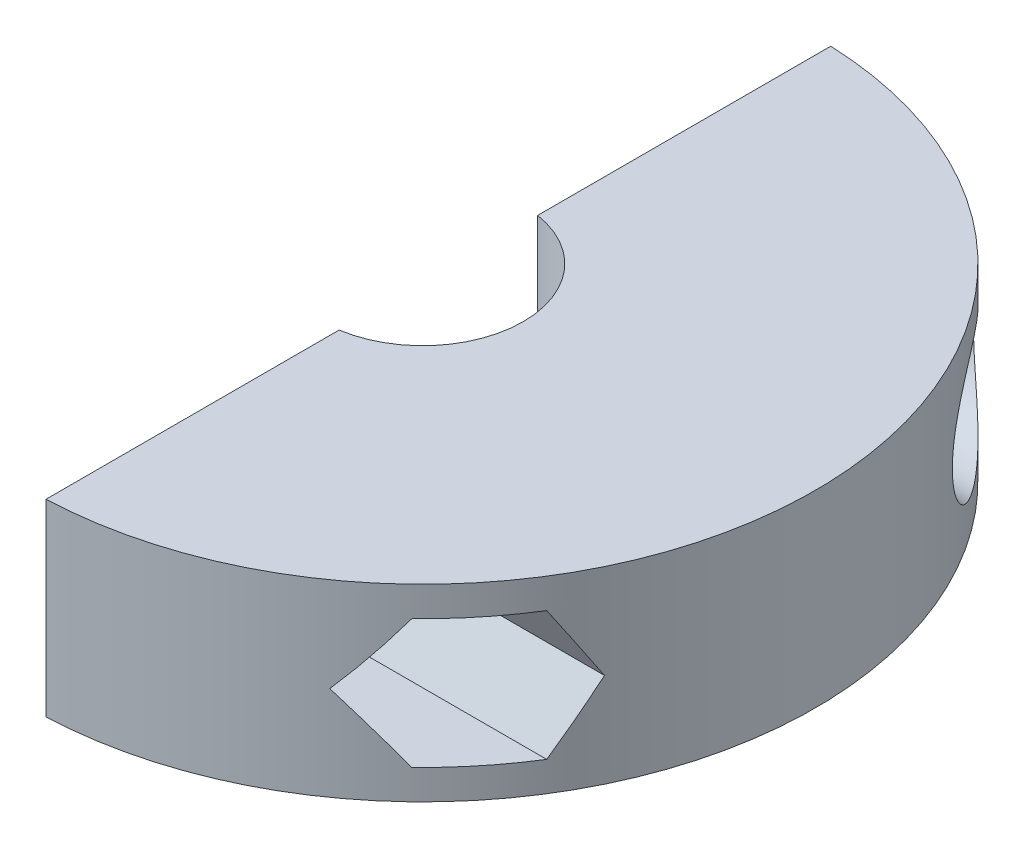
ISO-10303-21;
HEADER;
FILE_DESCRIPTION(('STEP AP214'),'2;1');
FILE_NAME('part.step','',(''),(''),'','','');
FILE_SCHEMA(('AUTOMOTIVE_DESIGN { 1 0 10303 214 1 1 1 1 }'));
ENDSEC;
DATA;
#1=APPLICATION_CONTEXT('core data for automotive mechanical design processes');
#2=APPLICATION_PROTOCOL_DEFINITION('international standard','automotive_design',2000,#1);
#3=PRODUCT_CONTEXT('',#1,'mechanical');
#4=PRODUCT('Part','Part','',(#3));
#5=PRODUCT_RELATED_PRODUCT_CATEGORY('part','',(#4));
#6=PRODUCT_DEFINITION_FORMATION('','',#4);
#7=PRODUCT_DEFINITION_CONTEXT('part definition',#1,'design');
#8=PRODUCT_DEFINITION('design','',#6,#7);
#9=PRODUCT_DEFINITION_SHAPE('','',#8);
#10=(LENGTH_UNIT() NAMED_UNIT(*) SI_UNIT(.MILLI.,.METRE.));
#11=(NAMED_UNIT(*) PLANE_ANGLE_UNIT() SI_UNIT($,.RADIAN.));
#12=(NAMED_UNIT(*) SI_UNIT($,.STERADIAN.) SOLID_ANGLE_UNIT());
#13=UNCERTAINTY_MEASURE_WITH_UNIT(LENGTH_MEASURE(1.E-05),#10,'distance_accuracy_value','');
#14=(GEOMETRIC_REPRESENTATION_CONTEXT(3) GLOBAL_UNCERTAINTY_ASSIGNED_CONTEXT((#13)) GLOBAL_UNIT_ASSIGNED_CONTEXT((#10,
#11,#12)) REPRESENTATION_CONTEXT('',''));
#15=CARTESIAN_POINT('',(0.,0.,0.));
#16=DIRECTION('',(0.,0.,1.));
#17=DIRECTION('',(1.,0.,0.));
#18=AXIS2_PLACEMENT_3D('',#15,#16,#17);
#19=CARTESIAN_POINT('',(0.,6.,0.));
#20=DIRECTION('',(0.,-1.,0.));
#21=DIRECTION('',(0.,0.,-1.));
#22=AXIS2_PLACEMENT_3D('',#19,#20,#21);
#23=CYLINDRICAL_SURFACE('',#22,12.5);
#24=CARTESIAN_POINT('',(0.,-14.6538969650262,0.));
#25=DIRECTION('',(0.,0.5,-0.866025403784439));
#26=DIRECTION('',(0.,-0.866025403784439,-0.5));
#27=AXIS2_PLACEMENT_3D('',#24,#25,#26);
#28=ELLIPSE('',#27,25.,12.5);
#29=CARTESIAN_POINT('',(7.23624953384555,3.,10.1924821650038));
#30=VERTEX_POINT('',#29);
#31=CARTESIAN_POINT('',(8.66541784922203,0.950000000000002,9.00891411316504));
#32=VERTEX_POINT('',#31);
#33=EDGE_CURVE('E11',#30,#32,#28,.T.);
#34=ORIENTED_EDGE('',*,*,#33,.F.);
#35=CARTESIAN_POINT('',(0.,20.6538969650262,0.));
#36=DIRECTION('',(0.,-0.5,-0.866025403784439));
#37=DIRECTION('',(0.,-0.866025403784439,0.5));
#38=AXIS2_PLACEMENT_3D('',#35,#36,#37);
#39=ELLIPSE('',#38,25.,12.5);
#40=CARTESIAN_POINT('',(8.66541784922203,5.05,9.00891411316504));
#41=VERTEX_POINT('',#40);
#42=EDGE_CURVE('E223',#41,#30,#39,.T.);
#43=ORIENTED_EDGE('',*,*,#42,.F.);
#44=CARTESIAN_POINT('',(0.,5.05,0.));
#45=DIRECTION('',(0.,-1.,0.));
#46=DIRECTION('',(0.,0.,-1.));
#47=AXIS2_PLACEMENT_3D('',#44,#45,#46);
#48=CIRCLE('',#47,12.5);
#49=CARTESIAN_POINT('',(10.5894657501069,5.05,6.64177800948758));
#50=VERTEX_POINT('',#49);
#51=EDGE_CURVE('E237',#50,#41,#48,.T.);
#52=ORIENTED_EDGE('',*,*,#51,.F.);
#53=CARTESIAN_POINT('',(0.,-6.45389696502617,0.));
#54=DIRECTION('',(0.,-0.5,0.866025403784439));
#55=DIRECTION('',(0.,-0.866025403784439,-0.5));
#56=AXIS2_PLACEMENT_3D('',#53,#54,#55);
#57=ELLIPSE('',#56,25.,12.5);
#58=CARTESIAN_POINT('',(11.2453521091259,3.,5.45820995764884));
#59=VERTEX_POINT('',#58);
#60=EDGE_CURVE('E240',#59,#50,#57,.T.);
#61=ORIENTED_EDGE('',*,*,#60,.F.);
#62=CARTESIAN_POINT('',(0.,12.4538969650262,0.));
#63=DIRECTION('',(0.,0.5,0.866025403784439));
#64=DIRECTION('',(0.,-0.866025403784439,0.5));
#65=AXIS2_PLACEMENT_3D('',#62,#63,#64);
#66=ELLIPSE('',#65,25.,12.5);
#67=CARTESIAN_POINT('',(10.5894657501069,0.950000000000002,6.64177800948758));
#68=VERTEX_POINT('',#67);
#69=EDGE_CURVE('E243',#68,#59,#66,.T.);
#70=ORIENTED_EDGE('',*,*,#69,.F.);
#71=CARTESIAN_POINT('',(0.,0.950000000000002,0.));
#72=DIRECTION('',(0.,1.,0.));
#73=DIRECTION('',(0.,0.,1.));
#74=AXIS2_PLACEMENT_3D('',#71,#72,#73);
#75=CIRCLE('',#74,12.5);
#76=EDGE_CURVE('E55',#32,#68,#75,.T.);
#77=ORIENTED_EDGE('',*,*,#76,.F.);
#78=EDGE_LOOP('',(#34,#43,#52,#61,#70,#77));
#79=FACE_BOUND('',#78,.T.);
#80=CARTESIAN_POINT('',(0.,0.,0.));
#81=DIRECTION('',(0.,1.,0.));
#82=DIRECTION('',(0.,0.,1.));
#83=AXIS2_PLACEMENT_3D('',#80,#81,#82);
#84=CIRCLE('',#83,12.5);
#85=CARTESIAN_POINT('',(0.500000000000003,0.,12.4899959967968));
#86=VERTEX_POINT('',#85);
#87=CARTESIAN_POINT('',(0.500000000000003,0.,-12.4899959967968));
#88=VERTEX_POINT('',#87);
#89=EDGE_CURVE('E208',#86,#88,#84,.T.);
#90=ORIENTED_EDGE('',*,*,#89,.T.);
#91=DIRECTION('',(0.,-1.,0.));
#92=VECTOR('',#91,1.);
#93=CARTESIAN_POINT('',(0.500000000000003,6.,-12.4899959967968));
#94=LINE('',#93,#92);
#95=CARTESIAN_POINT('',(0.500000000000003,6.,-12.4899959967968));
#96=VERTEX_POINT('',#95);
#97=EDGE_CURVE('E213',#96,#88,#94,.T.);
#98=ORIENTED_EDGE('',*,*,#97,.F.);
#99=CARTESIAN_POINT('',(0.,6.,0.));
#100=DIRECTION('',(0.,1.,0.));
#101=DIRECTION('',(0.,0.,1.));
#102=AXIS2_PLACEMENT_3D('',#99,#100,#101);
#103=CIRCLE('',#102,12.5);
#104=CARTESIAN_POINT('',(0.500000000000003,6.,12.4899959967968));
#105=VERTEX_POINT('',#104);
#106=EDGE_CURVE('E199',#105,#96,#103,.T.);
#107=ORIENTED_EDGE('',*,*,#106,.F.);
#108=DIRECTION('',(0.,-1.,0.));
#109=VECTOR('',#108,1.);
#110=CARTESIAN_POINT('',(0.500000000000003,6.,12.4899959967968));
#111=LINE('',#110,#109);
#112=EDGE_CURVE('E217',#105,#86,#111,.T.);
#113=ORIENTED_EDGE('',*,*,#112,.T.);
#114=EDGE_LOOP('',(#90,#98,#107,#113));
#115=FACE_BOUND('',#114,.T.);
#116=CARTESIAN_POINT('',(11.085818773186,3.,-5.77534606132631));
#117=CARTESIAN_POINT('',(11.0858170633485,2.89540984585334,-5.77535211054653));
#118=CARTESIAN_POINT('',(11.0816377428834,2.79072139109103,-5.78339364427921));
#119=CARTESIAN_POINT('',(11.064976005652,2.5843453053428,-5.81520538441773));
#120=CARTESIAN_POINT('',(11.0524811869024,2.48266239384835,-5.83899908379739));
#121=CARTESIAN_POINT('',(11.0194352730573,2.28548758869975,-5.90112458826294));
#122=CARTESIAN_POINT('',(10.9989021457573,2.18998243706214,-5.93942396306888));
#123=CARTESIAN_POINT('',(10.9501554189096,2.0073589274181,-6.02882035395589));
#124=CARTESIAN_POINT('',(10.9219434456797,1.92023879881373,-6.07991465999026));
#125=CARTESIAN_POINT('',(10.8573208712934,1.75351545335196,-6.19459751738478));
#126=CARTESIAN_POINT('',(10.8206753528818,1.67424496611988,-6.25853565593916));
#127=CARTESIAN_POINT('',(10.7404402527424,1.52780002833442,-6.39525009588926));
#128=CARTESIAN_POINT('',(10.6968484146776,1.46062952331174,-6.46802926724004));
#129=CARTESIAN_POINT('',(10.5988148080768,1.33287518140993,-6.62757319760674));
#130=CARTESIAN_POINT('',(10.5437229254328,1.27363159503466,-6.71500842510847));
#131=CARTESIAN_POINT('',(10.4271966569431,1.17055050439777,-6.89456658264717));
#132=CARTESIAN_POINT('',(10.3657590304266,1.12672092265216,-6.98669189553691));
#133=CARTESIAN_POINT('',(10.2279096029814,1.04842778134747,-7.18726653114217));
#134=CARTESIAN_POINT('',(10.1506402191502,1.01639457015823,-7.29607168620626));
#135=CARTESIAN_POINT('',(9.99073920284395,0.970801277263566,-7.51354799260688));
#136=CARTESIAN_POINT('',(9.90810495202707,0.957250287959829,-7.62221905172958));
#137=CARTESIAN_POINT('',(9.72286624348514,0.946260143430185,-7.85762666204073));
#138=CARTESIAN_POINT('',(9.61944401285101,0.952359235432933,-7.98388592125483));
#139=CARTESIAN_POINT('',(9.40925872645887,0.986584963097639,-8.23056665375733));
#140=CARTESIAN_POINT('',(9.3024918364829,1.01473783912397,-8.35098099118332));
#141=CARTESIAN_POINT('',(9.06851384886386,1.09854312518873,-8.60504786930911));
#142=CARTESIAN_POINT('',(8.94107198341707,1.15822354994391,-8.73719871275991));
#143=CARTESIAN_POINT('',(8.75210909567481,1.26847738219862,-8.92516448121353));
#144=CARTESIAN_POINT('',(8.68946799558569,1.30870073875028,-8.98612790900994));
#145=CARTESIAN_POINT('',(8.56558509825069,1.3961894716294,-9.10428786139593));
#146=CARTESIAN_POINT('',(8.50434274456181,1.44345198934099,-9.16148590158192));
#147=CARTESIAN_POINT('',(8.36153274787473,1.56433768024918,-9.29232576501349));
#148=CARTESIAN_POINT('',(8.28094977941882,1.6412017751425,-9.36409626453309));
#149=CARTESIAN_POINT('',(8.12728584107727,1.80960347163677,-9.49776483133019));
#150=CARTESIAN_POINT('',(8.0541914704013,1.90111408365153,-9.5596806474691));
#151=CARTESIAN_POINT('',(7.94002772892005,2.07095599980315,-9.65452147137628));
#152=CARTESIAN_POINT('',(7.89582816017574,2.14537566422725,-9.69064013136447));
#153=CARTESIAN_POINT('',(7.81646831928988,2.30215490372942,-9.75476393630732));
#154=CARTESIAN_POINT('',(7.78129386445883,2.38450173791726,-9.78278182028307));
#155=CARTESIAN_POINT('',(7.72892486389347,2.53930503976577,-9.82418535177261));
#156=CARTESIAN_POINT('',(7.70955737513359,2.6105358207218,-9.8393627068422));
#157=CARTESIAN_POINT('',(7.68043161176529,2.75611352188491,-9.86211538598454));
#158=CARTESIAN_POINT('',(7.67066405252414,2.83045735856345,-9.86969805544136));
#159=CARTESIAN_POINT('',(7.66173533285613,2.9804541988992,-9.8766314547436));
#160=CARTESIAN_POINT('',(7.66261281848868,3.05611097637311,-9.87595219021661));
#161=CARTESIAN_POINT('',(7.67497000725106,3.2060248430233,-9.86635145090657));
#162=CARTESIAN_POINT('',(7.68645463884971,3.28028126517598,-9.85742614470967));
#163=CARTESIAN_POINT('',(7.71809195204238,3.4220099581438,-9.83267152789186));
#164=CARTESIAN_POINT('',(7.73782692750894,3.48963717702853,-9.81717445672916));
#165=CARTESIAN_POINT('',(7.78436683588378,3.62068231958676,-9.78031264681147));
#166=CARTESIAN_POINT('',(7.81117460213658,3.6840985435729,-9.75894555639772));
#167=CARTESIAN_POINT('',(7.88876416269578,3.8442633726667,-9.69645092949993));
#168=CARTESIAN_POINT('',(7.94409127924697,3.93723418002779,-9.65129536389007));
#169=CARTESIAN_POINT('',(8.06426710642514,4.11101303591114,-9.55111234836297));
#170=CARTESIAN_POINT('',(8.12914551456755,4.19178149683329,-9.49605398512892));
#171=CARTESIAN_POINT('',(8.24738290148027,4.322440281955,-9.39335673507558));
#172=CARTESIAN_POINT('',(8.29941913665669,4.37493254501244,-9.34744575877801));
#173=CARTESIAN_POINT('',(8.40581262755793,4.47384088481425,-9.25188841521769));
#174=CARTESIAN_POINT('',(8.46017097619846,4.52025405766992,-9.20224028047355));
#175=CARTESIAN_POINT('',(8.62554647575183,4.65072508029667,-9.04834414857656));
#176=CARTESIAN_POINT('',(8.73890637518879,4.72605927436737,-8.93910811174023));
#177=CARTESIAN_POINT('',(8.97111857480655,4.85608162034293,-8.70614754828782));
#178=CARTESIAN_POINT('',(9.09002941245922,4.91001610559317,-8.58206663200317));
#179=CARTESIAN_POINT('',(9.3264991536215,4.99290816096691,-8.32448463234596));
#180=CARTESIAN_POINT('',(9.44405723959354,5.02185133705897,-8.19097816803902));
#181=CARTESIAN_POINT('',(9.689297313,5.05448880803468,-7.8998633815202));
#182=CARTESIAN_POINT('',(9.81642217861341,5.05459885220979,-7.74132155472523));
#183=CARTESIAN_POINT('',(9.99938300878459,5.02585891016651,-7.50150427958226));
#184=CARTESIAN_POINT('',(10.0590632525378,5.01147121438719,-7.42125868666452));
#185=CARTESIAN_POINT('',(10.175327809394,4.97251959130646,-7.26102377865689));
#186=CARTESIAN_POINT('',(10.2319139151795,4.94796162871804,-7.1810343409999));
#187=CARTESIAN_POINT('',(10.3591165144372,4.8784436323394,-6.99677993441399));
#188=CARTESIAN_POINT('',(10.4283494595566,4.82945347154901,-6.89303353301717));
#189=CARTESIAN_POINT('',(10.5586957010703,4.71196650885266,-6.69166136299388));
#190=CARTESIAN_POINT('',(10.6198143309202,4.64348261399455,-6.59403159647939));
#191=CARTESIAN_POINT('',(10.7328303064019,4.48653173343446,-6.40845154097163));
#192=CARTESIAN_POINT('',(10.7846561587053,4.39792079358857,-6.3205781263125));
#193=CARTESIAN_POINT('',(10.8770074447234,4.2025180360321,-6.16030044838209));
#194=CARTESIAN_POINT('',(10.9175367298036,4.09573243469953,-6.08789091494617));
#195=CARTESIAN_POINT('',(10.9816631424126,3.8820689823986,-5.97134293817357));
#196=CARTESIAN_POINT('',(11.0067670669104,3.77696728928921,-5.92476694169236));
#197=CARTESIAN_POINT('',(11.0468808740836,3.55884638376038,-5.84963802621216));
#198=CARTESIAN_POINT('',(11.0619145110882,3.44584650297047,-5.82104270328898));
#199=CARTESIAN_POINT('',(11.0764476523887,3.27638636591577,-5.79330562354068));
#200=CARTESIAN_POINT('',(11.0799589114371,3.22139300796158,-5.78658237295774));
#201=CARTESIAN_POINT('',(11.0846448850893,3.11094231085528,-5.77760106427368));
#202=CARTESIAN_POINT('',(11.0858196802533,3.05548498776668,-5.77534285222013));
#203=CARTESIAN_POINT('',(11.085818773186,3.,-5.77534606132631));
#204=B_SPLINE_CURVE_WITH_KNOTS('',3,(#116,#117,#118,#119,#120,#121,#122,#123,#124,#125,#126,
#127,#128,#129,#130,#131,#132,#133,#134,#135,#136,#137,#138,#139,#140,#141,#142,#143,#144,#145,
#146,#147,#148,#149,#150,#151,#152,#153,#154,#155,#156,#157,#158,#159,#160,#161,#162,#163,#164,
#165,#166,#167,#168,#169,#170,#171,#172,#173,#174,#175,#176,#177,#178,#179,#180,#181,#182,#183,
#184,#185,#186,#187,#188,#189,#190,#191,#192,#193,#194,#195,#196,#197,#198,#199,#200,#201,#202,
#203),.UNSPECIFIED.,.T.,.F.,(4,2,2,2,2,2,2,2,2,2,2,2,2,2,2,2,2,2,2,2,2,2,2,2,2,2,2,2,2,2,2,2,2,
2,2,2,2,2,2,2,2,2,2,4),(0.,0.313555171119666,0.627579038961087,0.940904949923286,
1.25416455254083,1.5775195945162,1.90097988515143,2.2569455431471,2.61309389448856,
3.02328373840582,3.43367530413058,3.9218058476478,4.41051806977327,4.98692438393526,
5.27531620256822,5.56359122250524,5.95990688423379,6.35550047757854,6.63599994616334,
6.91605588075611,7.14121131500479,7.36614877382939,7.59190309534409,7.81776236338957,
8.03335587600879,8.24903588640051,8.59875428740052,8.94958396670447,9.21028123787284,
9.47110258947561,9.99253320601265,10.5309735486783,11.0697238057728,11.6754179449288,
11.9780595550047,12.2805239209959,12.6808424137163,13.0808964645943,13.4839073187805,
13.8867806049815,14.2378695591455,14.5881274019278,14.7544738890147,14.9208146404525),.UNSPECIFIED.);
#205=CARTESIAN_POINT('',(11.085818773186,3.,-5.77534606132631));
#206=VERTEX_POINT('',#205);
#207=EDGE_CURVE('E45',#206,#206,#204,.T.);
#208=ORIENTED_EDGE('',*,*,#207,.F.);
#209=EDGE_LOOP('',(#208));
#210=FACE_BOUND('',#209,.T.);
#211=ADVANCED_FACE('F41',(#79,#115,#210),#23,.T.);
#212=CARTESIAN_POINT('',(12.5,3.,-7.82534606132631));
#213=DIRECTION('',(-1.,0.,0.));
#214=DIRECTION('',(0.,0.,1.));
#215=AXIS2_PLACEMENT_3D('',#212,#213,#214);
#216=CYLINDRICAL_SURFACE('',#215,1.1);
#217=CARTESIAN_POINT('',(0.500000000000002,3.,-7.82534606132631));
#218=DIRECTION('',(1.,0.,0.));
#219=DIRECTION('',(0.,0.,-1.));
#220=AXIS2_PLACEMENT_3D('',#217,#218,#219);
#221=CIRCLE('',#220,1.1);
#222=CARTESIAN_POINT('',(0.5,3.,-6.72534606132631));
#223=VERTEX_POINT('',#222);
#224=EDGE_CURVE('E191',#223,#223,#221,.F.);
#225=CARTESIAN_POINT('',(4.,3.,-7.82534606132631));
#226=DIRECTION('',(1.,0.,0.));
#227=DIRECTION('',(0.,0.,-1.));
#228=AXIS2_PLACEMENT_3D('',#225,#226,#227);
#229=CIRCLE('',#228,1.1);
#230=CARTESIAN_POINT('',(4.,3.,-6.72534606132631));
#231=VERTEX_POINT('',#230);
#232=EDGE_CURVE('E231',#231,#231,#229,.T.);
#233=CARTESIAN_POINT('',(0.5,3.,-6.72534606132631));
#234=CARTESIAN_POINT('',(0.536458333333334,3.,-6.72534606132631));
#235=CARTESIAN_POINT('',(0.572916666666667,3.,-6.72534606132631));
#236=CARTESIAN_POINT('',(0.645833333333334,3.,-6.72534606132631));
#237=CARTESIAN_POINT('',(0.682291666666667,3.,-6.72534606132631));
#238=CARTESIAN_POINT('',(0.755208333333334,3.,-6.72534606132631));
#239=CARTESIAN_POINT('',(0.791666666666667,3.,-6.72534606132631));
#240=CARTESIAN_POINT('',(0.864583333333334,3.,-6.72534606132631));
#241=CARTESIAN_POINT('',(0.901041666666668,3.,-6.72534606132631));
#242=CARTESIAN_POINT('',(0.973958333333334,3.,-6.72534606132631));
#243=CARTESIAN_POINT('',(1.01041666666667,3.,-6.72534606132631));
#244=CARTESIAN_POINT('',(1.08333333333333,3.,-6.72534606132631));
#245=CARTESIAN_POINT('',(1.11979166666667,3.,-6.72534606132631));
#246=CARTESIAN_POINT('',(1.19270833333333,3.,-6.72534606132631));
#247=CARTESIAN_POINT('',(1.22916666666667,3.,-6.72534606132631));
#248=CARTESIAN_POINT('',(1.30208333333333,3.,-6.72534606132631));
#249=CARTESIAN_POINT('',(1.33854166666667,3.,-6.72534606132631));
#250=CARTESIAN_POINT('',(1.41145833333333,3.,-6.72534606132631));
#251=CARTESIAN_POINT('',(1.44791666666667,3.,-6.72534606132631));
#252=CARTESIAN_POINT('',(1.52083333333333,3.,-6.72534606132631));
#253=CARTESIAN_POINT('',(1.55729166666667,3.,-6.72534606132631));
#254=CARTESIAN_POINT('',(1.63020833333333,3.,-6.72534606132631));
#255=CARTESIAN_POINT('',(1.66666666666667,3.,-6.72534606132631));
#256=CARTESIAN_POINT('',(1.73958333333333,3.,-6.72534606132631));
#257=CARTESIAN_POINT('',(1.77604166666667,3.,-6.72534606132631));
#258=CARTESIAN_POINT('',(1.84895833333333,3.,-6.72534606132631));
#259=CARTESIAN_POINT('',(1.88541666666667,3.,-6.72534606132631));
#260=CARTESIAN_POINT('',(1.95833333333333,3.,-6.72534606132631));
#261=CARTESIAN_POINT('',(1.99479166666667,3.,-6.72534606132631));
#262=CARTESIAN_POINT('',(2.06770833333333,3.,-6.72534606132631));
#263=CARTESIAN_POINT('',(2.10416666666667,3.,-6.72534606132631));
#264=CARTESIAN_POINT('',(2.17708333333333,3.,-6.72534606132631));
#265=CARTESIAN_POINT('',(2.21354166666667,3.,-6.72534606132631));
#266=CARTESIAN_POINT('',(2.28645833333333,3.,-6.72534606132631));
#267=CARTESIAN_POINT('',(2.32291666666667,3.,-6.72534606132631));
#268=CARTESIAN_POINT('',(2.39583333333333,3.,-6.72534606132631));
#269=CARTESIAN_POINT('',(2.43229166666667,3.,-6.72534606132631));
#270=CARTESIAN_POINT('',(2.50520833333333,3.,-6.72534606132631));
#271=CARTESIAN_POINT('',(2.54166666666667,3.,-6.72534606132631));
#272=CARTESIAN_POINT('',(2.61458333333333,3.,-6.72534606132631));
#273=CARTESIAN_POINT('',(2.65104166666667,3.,-6.72534606132631));
#274=CARTESIAN_POINT('',(2.72395833333333,3.,-6.72534606132631));
#275=CARTESIAN_POINT('',(2.76041666666667,3.,-6.72534606132631));
#276=CARTESIAN_POINT('',(2.83333333333333,3.,-6.72534606132631));
#277=CARTESIAN_POINT('',(2.86979166666667,3.,-6.72534606132631));
#278=CARTESIAN_POINT('',(2.94270833333333,3.,-6.72534606132631));
#279=CARTESIAN_POINT('',(2.97916666666667,3.,-6.72534606132631));
#280=CARTESIAN_POINT('',(3.05208333333333,3.,-6.72534606132631));
#281=CARTESIAN_POINT('',(3.08854166666667,3.,-6.72534606132631));
#282=CARTESIAN_POINT('',(3.16145833333333,3.,-6.72534606132631));
#283=CARTESIAN_POINT('',(3.19791666666667,3.,-6.72534606132631));
#284=CARTESIAN_POINT('',(3.27083333333333,3.,-6.72534606132631));
#285=CARTESIAN_POINT('',(3.30729166666667,3.,-6.72534606132631));
#286=CARTESIAN_POINT('',(3.38020833333333,3.,-6.72534606132631));
#287=CARTESIAN_POINT('',(3.41666666666667,3.,-6.72534606132631));
#288=CARTESIAN_POINT('',(3.48958333333333,3.,-6.72534606132631));
#289=CARTESIAN_POINT('',(3.52604166666667,3.,-6.72534606132631));
#290=CARTESIAN_POINT('',(3.59895833333333,3.,-6.72534606132631));
#291=CARTESIAN_POINT('',(3.63541666666667,3.,-6.72534606132631));
#292=CARTESIAN_POINT('',(3.70833333333333,3.,-6.72534606132631));
#293=CARTESIAN_POINT('',(3.74479166666667,3.,-6.72534606132631));
#294=CARTESIAN_POINT('',(3.81770833333333,3.,-6.72534606132631));
#295=CARTESIAN_POINT('',(3.85416666666667,3.,-6.72534606132631));
#296=CARTESIAN_POINT('',(3.92708333333333,3.,-6.72534606132631));
#297=CARTESIAN_POINT('',(3.96354166666667,3.,-6.72534606132631));
#298=CARTESIAN_POINT('',(4.,3.,-6.72534606132631));
#299=B_SPLINE_CURVE_WITH_KNOTS('',3,(#233,#234,#235,#236,#237,#238,#239,#240,#241,#242,#243,
#244,#245,#246,#247,#248,#249,#250,#251,#252,#253,#254,#255,#256,#257,#258,#259,#260,#261,#262,
#263,#264,#265,#266,#267,#268,#269,#270,#271,#272,#273,#274,#275,#276,#277,#278,#279,#280,#281,
#282,#283,#284,#285,#286,#287,#288,#289,#290,#291,#292,#293,#294,#295,#296,#297,#298),
.UNSPECIFIED.,.F.,.F.,(4,2,2,2,2,2,2,2,2,2,2,2,2,2,2,2,2,2,2,2,2,2,2,2,2,2,2,2,2,2,2,2,4),(0.,
0.109375,0.21875,0.328125,0.4375,0.546875,0.656250000000001,0.765625000000001,0.875000000000001,
0.984374999999999,1.09375,1.203125,1.3125,1.421875,1.53125,1.640625,1.75,1.859375,1.96875,
2.078125,2.1875,2.296875,2.40625,2.515625,2.625,2.734375,2.84375,2.953125,3.0625,3.171875,
3.28125,3.390625,3.5),.UNSPECIFIED.);
#300=EDGE_CURVE('BSEAM275',#223,#231,#299,.T.);
#301=ORIENTED_EDGE('',*,*,#224,.T.);
#302=ORIENTED_EDGE('',*,*,#232,.T.);
#303=ORIENTED_EDGE('',*,*,#300,.T.);
#304=ORIENTED_EDGE('',*,*,#300,.F.);
#305=EDGE_LOOP('',(#301,#303,#302,#304));
#306=FACE_BOUND('',#305,.T.);
#307=ADVANCED_FACE('F275',(#306),#216,.F.);
#308=CARTESIAN_POINT('',(12.5,3.,7.82534606132631));
#309=DIRECTION('',(-1.,0.,0.));
#310=DIRECTION('',(0.,0.,1.));
#311=AXIS2_PLACEMENT_3D('',#308,#309,#310);
#312=CYLINDRICAL_SURFACE('',#311,1.1);
#313=CARTESIAN_POINT('',(0.500000000000002,3.,7.82534606132631));
#314=DIRECTION('',(1.,0.,0.));
#315=DIRECTION('',(0.,0.,-1.));
#316=AXIS2_PLACEMENT_3D('',#313,#314,#315);
#317=CIRCLE('',#316,1.1);
#318=CARTESIAN_POINT('',(0.5,3.,8.92534606132631));
#319=VERTEX_POINT('',#318);
#320=EDGE_CURVE('E186',#319,#319,#317,.F.);
#321=CARTESIAN_POINT('',(4.,3.,7.82534606132631));
#322=DIRECTION('',(1.,0.,0.));
#323=DIRECTION('',(0.,0.,-1.));
#324=AXIS2_PLACEMENT_3D('',#321,#322,#323);
#325=CIRCLE('',#324,1.1);
#326=CARTESIAN_POINT('',(4.,3.,8.92534606132631));
#327=VERTEX_POINT('',#326);
#328=EDGE_CURVE('E227',#327,#327,#325,.T.);
#329=CARTESIAN_POINT('',(0.5,3.,8.92534606132631));
#330=CARTESIAN_POINT('',(0.536458333333334,3.,8.92534606132631));
#331=CARTESIAN_POINT('',(0.572916666666667,3.,8.92534606132631));
#332=CARTESIAN_POINT('',(0.645833333333334,3.,8.92534606132631));
#333=CARTESIAN_POINT('',(0.682291666666667,3.,8.92534606132631));
#334=CARTESIAN_POINT('',(0.755208333333334,3.,8.92534606132631));
#335=CARTESIAN_POINT('',(0.791666666666667,3.,8.92534606132631));
#336=CARTESIAN_POINT('',(0.864583333333334,3.,8.92534606132631));
#337=CARTESIAN_POINT('',(0.901041666666668,3.,8.92534606132631));
#338=CARTESIAN_POINT('',(0.973958333333334,3.,8.92534606132631));
#339=CARTESIAN_POINT('',(1.01041666666667,3.,8.92534606132631));
#340=CARTESIAN_POINT('',(1.08333333333333,3.,8.92534606132631));
#341=CARTESIAN_POINT('',(1.11979166666667,3.,8.92534606132631));
#342=CARTESIAN_POINT('',(1.19270833333333,3.,8.92534606132631));
#343=CARTESIAN_POINT('',(1.22916666666667,3.,8.92534606132631));
#344=CARTESIAN_POINT('',(1.30208333333333,3.,8.92534606132631));
#345=CARTESIAN_POINT('',(1.33854166666667,3.,8.92534606132631));
#346=CARTESIAN_POINT('',(1.41145833333333,3.,8.92534606132631));
#347=CARTESIAN_POINT('',(1.44791666666667,3.,8.92534606132631));
#348=CARTESIAN_POINT('',(1.52083333333333,3.,8.92534606132631));
#349=CARTESIAN_POINT('',(1.55729166666667,3.,8.92534606132631));
#350=CARTESIAN_POINT('',(1.63020833333333,3.,8.92534606132631));
#351=CARTESIAN_POINT('',(1.66666666666667,3.,8.92534606132631));
#352=CARTESIAN_POINT('',(1.73958333333333,3.,8.92534606132631));
#353=CARTESIAN_POINT('',(1.77604166666667,3.,8.92534606132631));
#354=CARTESIAN_POINT('',(1.84895833333333,3.,8.92534606132631));
#355=CARTESIAN_POINT('',(1.88541666666667,3.,8.92534606132631));
#356=CARTESIAN_POINT('',(1.95833333333333,3.,8.92534606132631));
#357=CARTESIAN_POINT('',(1.99479166666667,3.,8.92534606132631));
#358=CARTESIAN_POINT('',(2.06770833333333,3.,8.92534606132631));
#359=CARTESIAN_POINT('',(2.10416666666667,3.,8.92534606132631));
#360=CARTESIAN_POINT('',(2.17708333333333,3.,8.92534606132631));
#361=CARTESIAN_POINT('',(2.21354166666667,3.,8.92534606132631));
#362=CARTESIAN_POINT('',(2.28645833333333,3.,8.92534606132631));
#363=CARTESIAN_POINT('',(2.32291666666667,3.,8.92534606132631));
#364=CARTESIAN_POINT('',(2.39583333333333,3.,8.92534606132631));
#365=CARTESIAN_POINT('',(2.43229166666667,3.,8.92534606132631));
#366=CARTESIAN_POINT('',(2.50520833333333,3.,8.92534606132631));
#367=CARTESIAN_POINT('',(2.54166666666667,3.,8.92534606132631));
#368=CARTESIAN_POINT('',(2.61458333333333,3.,8.92534606132631));
#369=CARTESIAN_POINT('',(2.65104166666667,3.,8.92534606132631));
#370=CARTESIAN_POINT('',(2.72395833333333,3.,8.92534606132631));
#371=CARTESIAN_POINT('',(2.76041666666667,3.,8.92534606132631));
#372=CARTESIAN_POINT('',(2.83333333333333,3.,8.92534606132631));
#373=CARTESIAN_POINT('',(2.86979166666667,3.,8.92534606132631));
#374=CARTESIAN_POINT('',(2.94270833333333,3.,8.92534606132631));
#375=CARTESIAN_POINT('',(2.97916666666667,3.,8.92534606132631));
#376=CARTESIAN_POINT('',(3.05208333333333,3.,8.92534606132631));
#377=CARTESIAN_POINT('',(3.08854166666667,3.,8.92534606132631));
#378=CARTESIAN_POINT('',(3.16145833333333,3.,8.92534606132631));
#379=CARTESIAN_POINT('',(3.19791666666667,3.,8.92534606132631));
#380=CARTESIAN_POINT('',(3.27083333333333,3.,8.92534606132631));
#381=CARTESIAN_POINT('',(3.30729166666667,3.,8.92534606132631));
#382=CARTESIAN_POINT('',(3.38020833333333,3.,8.92534606132631));
#383=CARTESIAN_POINT('',(3.41666666666667,3.,8.92534606132631));
#384=CARTESIAN_POINT('',(3.48958333333333,3.,8.92534606132631));
#385=CARTESIAN_POINT('',(3.52604166666667,3.,8.92534606132631));
#386=CARTESIAN_POINT('',(3.59895833333333,3.,8.92534606132631));
#387=CARTESIAN_POINT('',(3.63541666666667,3.,8.92534606132631));
#388=CARTESIAN_POINT('',(3.70833333333333,3.,8.92534606132631));
#389=CARTESIAN_POINT('',(3.74479166666667,3.,8.92534606132631));
#390=CARTESIAN_POINT('',(3.81770833333333,3.,8.92534606132631));
#391=CARTESIAN_POINT('',(3.85416666666667,3.,8.92534606132631));
#392=CARTESIAN_POINT('',(3.92708333333333,3.,8.92534606132631));
#393=CARTESIAN_POINT('',(3.96354166666667,3.,8.92534606132631));
#394=CARTESIAN_POINT('',(4.,3.,8.92534606132631));
#395=B_SPLINE_CURVE_WITH_KNOTS('',3,(#329,#330,#331,#332,#333,#334,#335,#336,#337,#338,#339,
#340,#341,#342,#343,#344,#345,#346,#347,#348,#349,#350,#351,#352,#353,#354,#355,#356,#357,#358,
#359,#360,#361,#362,#363,#364,#365,#366,#367,#368,#369,#370,#371,#372,#373,#374,#375,#376,#377,
#378,#379,#380,#381,#382,#383,#384,#385,#386,#387,#388,#389,#390,#391,#392,#393,#394),
.UNSPECIFIED.,.F.,.F.,(4,2,2,2,2,2,2,2,2,2,2,2,2,2,2,2,2,2,2,2,2,2,2,2,2,2,2,2,2,2,2,2,4),(0.,
0.109375,0.21875,0.328125,0.4375,0.546875,0.656250000000001,0.765625000000001,0.875000000000001,
0.984374999999999,1.09375,1.203125,1.3125,1.421875,1.53125,1.640625,1.75,1.859375,1.96875,
2.078125,2.1875,2.296875,2.40625,2.515625,2.625,2.734375,2.84375,2.953125,3.0625,3.171875,
3.28125,3.390625,3.5),.UNSPECIFIED.);
#396=EDGE_CURVE('BSEAM279',#319,#327,#395,.T.);
#397=ORIENTED_EDGE('',*,*,#320,.T.);
#398=ORIENTED_EDGE('',*,*,#328,.T.);
#399=ORIENTED_EDGE('',*,*,#396,.T.);
#400=ORIENTED_EDGE('',*,*,#396,.F.);
#401=EDGE_LOOP('',(#397,#399,#398,#400));
#402=FACE_BOUND('',#401,.T.);
#403=ADVANCED_FACE('F279',(#402),#312,.F.);
#404=CARTESIAN_POINT('',(0.,6.,0.));
#405=DIRECTION('',(0.,-1.,0.));
#406=DIRECTION('',(0.,0.,-1.));
#407=AXIS2_PLACEMENT_3D('',#404,#405,#406);
#408=CYLINDRICAL_SURFACE('',#407,3.2);
#409=CARTESIAN_POINT('',(0.,0.,0.));
#410=DIRECTION('',(0.,1.,0.));
#411=DIRECTION('',(0.,0.,1.));
#412=AXIS2_PLACEMENT_3D('',#409,#410,#411);
#413=CIRCLE('',#412,3.2);
#414=CARTESIAN_POINT('',(0.500000000000003,0.,3.16069612585582));
#415=VERTEX_POINT('',#414);
#416=CARTESIAN_POINT('',(0.500000000000003,0.,-3.16069612585582));
#417=VERTEX_POINT('',#416);
#418=EDGE_CURVE('E190',#415,#417,#413,.T.);
#419=ORIENTED_EDGE('',*,*,#418,.F.);
#420=DIRECTION('',(0.,-1.,0.));
#421=VECTOR('',#420,1.);
#422=CARTESIAN_POINT('',(0.500000000000003,6.,3.16069612585582));
#423=LINE('',#422,#421);
#424=CARTESIAN_POINT('',(0.500000000000003,6.,3.16069612585582));
#425=VERTEX_POINT('',#424);
#426=EDGE_CURVE('E96',#425,#415,#423,.T.);
#427=ORIENTED_EDGE('',*,*,#426,.F.);
#428=CARTESIAN_POINT('',(0.,6.,0.));
#429=DIRECTION('',(0.,1.,0.));
#430=DIRECTION('',(0.,0.,1.));
#431=AXIS2_PLACEMENT_3D('',#428,#429,#430);
#432=CIRCLE('',#431,3.2);
#433=CARTESIAN_POINT('',(0.500000000000003,6.,-3.16069612585582));
#434=VERTEX_POINT('',#433);
#435=EDGE_CURVE('E192',#425,#434,#432,.T.);
#436=ORIENTED_EDGE('',*,*,#435,.T.);
#437=DIRECTION('',(0.,-1.,0.));
#438=VECTOR('',#437,1.);
#439=CARTESIAN_POINT('',(0.500000000000003,6.,-3.16069612585582));
#440=LINE('',#439,#438);
#441=EDGE_CURVE('E92',#434,#417,#440,.T.);
#442=ORIENTED_EDGE('',*,*,#441,.T.);
#443=EDGE_LOOP('',(#419,#427,#436,#442));
#444=FACE_BOUND('',#443,.T.);
#445=ADVANCED_FACE('F43',(#444),#408,.F.);
#446=CARTESIAN_POINT('',(0.500000000000003,6.,0.));
#447=DIRECTION('',(1.,0.,0.));
#448=DIRECTION('',(0.,0.,-1.));
#449=AXIS2_PLACEMENT_3D('',#446,#447,#448);
#450=PLANE('',#449);
#451=ORIENTED_EDGE('',*,*,#320,.F.);
#452=EDGE_LOOP('',(#451));
#453=FACE_BOUND('',#452,.T.);
#454=DIRECTION('',(0.,0.,1.));
#455=VECTOR('',#454,1.);
#456=CARTESIAN_POINT('',(0.500000000000003,0.,0.));
#457=LINE('',#456,#455);
#458=EDGE_CURVE('E205',#415,#86,#457,.T.);
#459=ORIENTED_EDGE('',*,*,#458,.T.);
#460=ORIENTED_EDGE('',*,*,#112,.F.);
#461=DIRECTION('',(0.,0.,1.));
#462=VECTOR('',#461,1.);
#463=CARTESIAN_POINT('',(0.500000000000003,6.,0.));
#464=LINE('',#463,#462);
#465=EDGE_CURVE('E195',#425,#105,#464,.T.);
#466=ORIENTED_EDGE('',*,*,#465,.F.);
#467=ORIENTED_EDGE('',*,*,#426,.T.);
#468=EDGE_LOOP('',(#459,#460,#466,#467));
#469=FACE_BOUND('',#468,.T.);
#470=ADVANCED_FACE('F288',(#453,#469),#450,.F.);
#471=ORIENTED_EDGE('',*,*,#224,.F.);
#472=EDGE_LOOP('',(#471));
#473=FACE_BOUND('',#472,.T.);
#474=EDGE_CURVE('E196',#88,#417,#457,.T.);
#475=ORIENTED_EDGE('',*,*,#474,.T.);
#476=ORIENTED_EDGE('',*,*,#441,.F.);
#477=EDGE_CURVE('E71',#96,#434,#464,.T.);
#478=ORIENTED_EDGE('',*,*,#477,.F.);
#479=ORIENTED_EDGE('',*,*,#97,.T.);
#480=EDGE_LOOP('',(#475,#476,#478,#479));
#481=FACE_BOUND('',#480,.T.);
#482=ADVANCED_FACE('F284',(#473,#481),#450,.F.);
#483=CARTESIAN_POINT('',(0.,6.,0.));
#484=DIRECTION('',(0.,1.,0.));
#485=DIRECTION('',(0.,0.,1.));
#486=AXIS2_PLACEMENT_3D('',#483,#484,#485);
#487=PLANE('',#486);
#488=ORIENTED_EDGE('',*,*,#435,.F.);
#489=ORIENTED_EDGE('',*,*,#465,.T.);
#490=ORIENTED_EDGE('',*,*,#106,.T.);
#491=ORIENTED_EDGE('',*,*,#477,.T.);
#492=EDGE_LOOP('',(#488,#489,#490,#491));
#493=FACE_BOUND('',#492,.T.);
#494=ADVANCED_FACE('F287',(#493),#487,.T.);
#495=CARTESIAN_POINT('',(0.,0.,0.));
#496=DIRECTION('',(0.,1.,0.));
#497=DIRECTION('',(0.,0.,1.));
#498=AXIS2_PLACEMENT_3D('',#495,#496,#497);
#499=PLANE('',#498);
#500=ORIENTED_EDGE('',*,*,#418,.T.);
#501=ORIENTED_EDGE('',*,*,#474,.F.);
#502=ORIENTED_EDGE('',*,*,#89,.F.);
#503=ORIENTED_EDGE('',*,*,#458,.F.);
#504=EDGE_LOOP('',(#500,#501,#502,#503));
#505=FACE_BOUND('',#504,.T.);
#506=ADVANCED_FACE('F290',(#505),#499,.F.);
#507=CARTESIAN_POINT('',(12.5,3.,10.1924821650038));
#508=DIRECTION('',(0.,0.5,-0.866025403784439));
#509=DIRECTION('',(0.,0.866025403784439,0.5));
#510=AXIS2_PLACEMENT_3D('',#507,#508,#509);
#511=PLANE('',#510);
#512=ORIENTED_EDGE('',*,*,#33,.T.);
#513=DIRECTION('',(-1.,0.,0.));
#514=VECTOR('',#513,1.);
#515=CARTESIAN_POINT('',(12.5,0.950000000000002,9.00891411316504));
#516=LINE('',#515,#514);
#517=CARTESIAN_POINT('',(4.,0.950000000000002,9.00891411316504));
#518=VERTEX_POINT('',#517);
#519=EDGE_CURVE('E131',#32,#518,#516,.T.);
#520=ORIENTED_EDGE('',*,*,#519,.T.);
#521=DIRECTION('',(0.,-0.866025403784439,-0.5));
#522=VECTOR('',#521,1.);
#523=CARTESIAN_POINT('',(4.,3.,10.1924821650038));
#524=LINE('',#523,#522);
#525=CARTESIAN_POINT('',(4.,3.,10.1924821650038));
#526=VERTEX_POINT('',#525);
#527=EDGE_CURVE('E136',#526,#518,#524,.T.);
#528=ORIENTED_EDGE('',*,*,#527,.F.);
#529=DIRECTION('',(-1.,0.,0.));
#530=VECTOR('',#529,1.);
#531=CARTESIAN_POINT('',(12.5,3.,10.1924821650038));
#532=LINE('',#531,#530);
#533=EDGE_CURVE('E173',#30,#526,#532,.T.);
#534=ORIENTED_EDGE('',*,*,#533,.F.);
#535=EDGE_LOOP('',(#512,#520,#528,#534));
#536=FACE_BOUND('',#535,.T.);
#537=ADVANCED_FACE('F133',(#536),#511,.T.);
#538=CARTESIAN_POINT('',(12.5,0.950000000000002,9.00891411316504));
#539=DIRECTION('',(0.,1.,0.));
#540=DIRECTION('',(0.,0.,1.));
#541=AXIS2_PLACEMENT_3D('',#538,#539,#540);
#542=PLANE('',#541);
#543=ORIENTED_EDGE('',*,*,#76,.T.);
#544=DIRECTION('',(-1.,0.,0.));
#545=VECTOR('',#544,1.);
#546=CARTESIAN_POINT('',(12.5,0.950000000000002,6.64177800948758));
#547=LINE('',#546,#545);
#548=CARTESIAN_POINT('',(4.,0.950000000000002,6.64177800948758));
#549=VERTEX_POINT('',#548);
#550=EDGE_CURVE('E142',#68,#549,#547,.T.);
#551=ORIENTED_EDGE('',*,*,#550,.T.);
#552=DIRECTION('',(0.,0.,-1.));
#553=VECTOR('',#552,1.);
#554=CARTESIAN_POINT('',(4.,0.950000000000002,9.00891411316504));
#555=LINE('',#554,#553);
#556=EDGE_CURVE('E145',#518,#549,#555,.T.);
#557=ORIENTED_EDGE('',*,*,#556,.F.);
#558=ORIENTED_EDGE('',*,*,#519,.F.);
#559=EDGE_LOOP('',(#543,#551,#557,#558));
#560=FACE_BOUND('',#559,.T.);
#561=ADVANCED_FACE('F146',(#560),#542,.T.);
#562=CARTESIAN_POINT('',(12.5,0.950000000000002,6.64177800948758));
#563=DIRECTION('',(0.,0.5,0.866025403784439));
#564=DIRECTION('',(0.,-0.866025403784439,0.5));
#565=AXIS2_PLACEMENT_3D('',#562,#563,#564);
#566=PLANE('',#565);
#567=ORIENTED_EDGE('',*,*,#69,.T.);
#568=DIRECTION('',(-1.,0.,0.));
#569=VECTOR('',#568,1.);
#570=CARTESIAN_POINT('',(12.5,3.,5.45820995764884));
#571=LINE('',#570,#569);
#572=CARTESIAN_POINT('',(4.,3.,5.45820995764884));
#573=VERTEX_POINT('',#572);
#574=EDGE_CURVE('E181',#59,#573,#571,.T.);
#575=ORIENTED_EDGE('',*,*,#574,.T.);
#576=DIRECTION('',(0.,0.866025403784439,-0.5));
#577=VECTOR('',#576,1.);
#578=CARTESIAN_POINT('',(4.,0.950000000000002,6.64177800948758));
#579=LINE('',#578,#577);
#580=EDGE_CURVE('E152',#549,#573,#579,.T.);
#581=ORIENTED_EDGE('',*,*,#580,.F.);
#582=ORIENTED_EDGE('',*,*,#550,.F.);
#583=EDGE_LOOP('',(#567,#575,#581,#582));
#584=FACE_BOUND('',#583,.T.);
#585=ADVANCED_FACE('F250',(#584),#566,.T.);
#586=CARTESIAN_POINT('',(12.5,3.,5.45820995764884));
#587=DIRECTION('',(0.,-0.5,0.866025403784439));
#588=DIRECTION('',(0.,-0.866025403784439,-0.5));
#589=AXIS2_PLACEMENT_3D('',#586,#587,#588);
#590=PLANE('',#589);
#591=ORIENTED_EDGE('',*,*,#60,.T.);
#592=DIRECTION('',(-1.,0.,0.));
#593=VECTOR('',#592,1.);
#594=CARTESIAN_POINT('',(12.5,5.05,6.64177800948758));
#595=LINE('',#594,#593);
#596=CARTESIAN_POINT('',(4.,5.05,6.64177800948758));
#597=VERTEX_POINT('',#596);
#598=EDGE_CURVE('E178',#50,#597,#595,.T.);
#599=ORIENTED_EDGE('',*,*,#598,.T.);
#600=DIRECTION('',(0.,0.866025403784439,0.5));
#601=VECTOR('',#600,1.);
#602=CARTESIAN_POINT('',(4.,3.,5.45820995764884));
#603=LINE('',#602,#601);
#604=EDGE_CURVE('E164',#573,#597,#603,.T.);
#605=ORIENTED_EDGE('',*,*,#604,.F.);
#606=ORIENTED_EDGE('',*,*,#574,.F.);
#607=EDGE_LOOP('',(#591,#599,#605,#606));
#608=FACE_BOUND('',#607,.T.);
#609=ADVANCED_FACE('F258',(#608),#590,.T.);
#610=CARTESIAN_POINT('',(12.5,5.05,6.64177800948758));
#611=DIRECTION('',(0.,-1.,0.));
#612=DIRECTION('',(0.,0.,-1.));
#613=AXIS2_PLACEMENT_3D('',#610,#611,#612);
#614=PLANE('',#613);
#615=ORIENTED_EDGE('',*,*,#51,.T.);
#616=DIRECTION('',(-1.,0.,0.));
#617=VECTOR('',#616,1.);
#618=CARTESIAN_POINT('',(12.5,5.05,9.00891411316504));
#619=LINE('',#618,#617);
#620=CARTESIAN_POINT('',(4.,5.05,9.00891411316504));
#621=VERTEX_POINT('',#620);
#622=EDGE_CURVE('E62',#41,#621,#619,.T.);
#623=ORIENTED_EDGE('',*,*,#622,.T.);
#624=DIRECTION('',(0.,0.,1.));
#625=VECTOR('',#624,1.);
#626=CARTESIAN_POINT('',(4.,5.05,6.64177800948758));
#627=LINE('',#626,#625);
#628=EDGE_CURVE('E168',#597,#621,#627,.T.);
#629=ORIENTED_EDGE('',*,*,#628,.F.);
#630=ORIENTED_EDGE('',*,*,#598,.F.);
#631=EDGE_LOOP('',(#615,#623,#629,#630));
#632=FACE_BOUND('',#631,.T.);
#633=ADVANCED_FACE('F262',(#632),#614,.T.);
#634=CARTESIAN_POINT('',(12.5,5.05,9.00891411316504));
#635=DIRECTION('',(0.,-0.5,-0.866025403784439));
#636=DIRECTION('',(0.,0.866025403784439,-0.5));
#637=AXIS2_PLACEMENT_3D('',#634,#635,#636);
#638=PLANE('',#637);
#639=ORIENTED_EDGE('',*,*,#42,.T.);
#640=ORIENTED_EDGE('',*,*,#533,.T.);
#641=DIRECTION('',(0.,-0.866025403784439,0.5));
#642=VECTOR('',#641,1.);
#643=CARTESIAN_POINT('',(4.,5.05,9.00891411316504));
#644=LINE('',#643,#642);
#645=EDGE_CURVE('E157',#621,#526,#644,.T.);
#646=ORIENTED_EDGE('',*,*,#645,.F.);
#647=ORIENTED_EDGE('',*,*,#622,.F.);
#648=EDGE_LOOP('',(#639,#640,#646,#647));
#649=FACE_BOUND('',#648,.T.);
#650=ADVANCED_FACE('F263',(#649),#638,.T.);
#651=CARTESIAN_POINT('',(4.,0.,0.));
#652=DIRECTION('',(1.,0.,0.));
#653=DIRECTION('',(0.,0.,-1.));
#654=AXIS2_PLACEMENT_3D('',#651,#652,#653);
#655=PLANE('',#654);
#656=ORIENTED_EDGE('',*,*,#328,.F.);
#657=EDGE_LOOP('',(#656));
#658=FACE_BOUND('',#657,.T.);
#659=ORIENTED_EDGE('',*,*,#527,.T.);
#660=ORIENTED_EDGE('',*,*,#556,.T.);
#661=ORIENTED_EDGE('',*,*,#580,.T.);
#662=ORIENTED_EDGE('',*,*,#604,.T.);
#663=ORIENTED_EDGE('',*,*,#628,.T.);
#664=ORIENTED_EDGE('',*,*,#645,.T.);
#665=EDGE_LOOP('',(#659,#660,#661,#662,#663,#664));
#666=FACE_BOUND('',#665,.T.);
#667=ADVANCED_FACE('F155',(#658,#666),#655,.T.);
#668=CARTESIAN_POINT('',(12.5,3.,-7.82534606132631));
#669=DIRECTION('',(-1.,0.,0.));
#670=DIRECTION('',(0.,0.,1.));
#671=AXIS2_PLACEMENT_3D('',#668,#669,#670);
#672=CYLINDRICAL_SURFACE('',#671,2.05);
#673=CARTESIAN_POINT('',(4.,3.,-7.82534606132631));
#674=DIRECTION('',(1.,0.,0.));
#675=DIRECTION('',(0.,0.,-1.));
#676=AXIS2_PLACEMENT_3D('',#673,#674,#675);
#677=CIRCLE('',#676,2.05);
#678=CARTESIAN_POINT('',(4.,3.,-9.87534606132631));
#679=VERTEX_POINT('',#678);
#680=EDGE_CURVE('E141',#679,#679,#677,.T.);
#681=ORIENTED_EDGE('',*,*,#680,.F.);
#682=EDGE_LOOP('',(#681));
#683=FACE_BOUND('',#682,.T.);
#684=ORIENTED_EDGE('',*,*,#207,.T.);
#685=EDGE_LOOP('',(#684));
#686=FACE_BOUND('',#685,.T.);
#687=ADVANCED_FACE('F270',(#683,#686),#672,.F.);
#688=CARTESIAN_POINT('',(4.,3.,-7.82534606132631));
#689=DIRECTION('',(1.,0.,0.));
#690=DIRECTION('',(0.,0.,-1.));
#691=AXIS2_PLACEMENT_3D('',#688,#689,#690);
#692=PLANE('',#691);
#693=ORIENTED_EDGE('',*,*,#232,.F.);
#694=EDGE_LOOP('',(#693));
#695=FACE_BOUND('',#694,.T.);
#696=ORIENTED_EDGE('',*,*,#680,.T.);
#697=EDGE_LOOP('',(#696));
#698=FACE_BOUND('',#697,.T.);
#699=ADVANCED_FACE('F333',(#695,#698),#692,.T.);
#700=CLOSED_SHELL('',(#211,#307,#403,#445,#470,#482,#494,#506,#537,#561,#585,#609,#633,#650,
#667,#687,#699));
#701=MANIFOLD_SOLID_BREP('B2',#700);
#702=ADVANCED_BREP_SHAPE_REPRESENTATION('',(#18,#701),#14);
#703=SHAPE_DEFINITION_REPRESENTATION(#9,#702);
ENDSEC;
END-ISO-10303-21;
